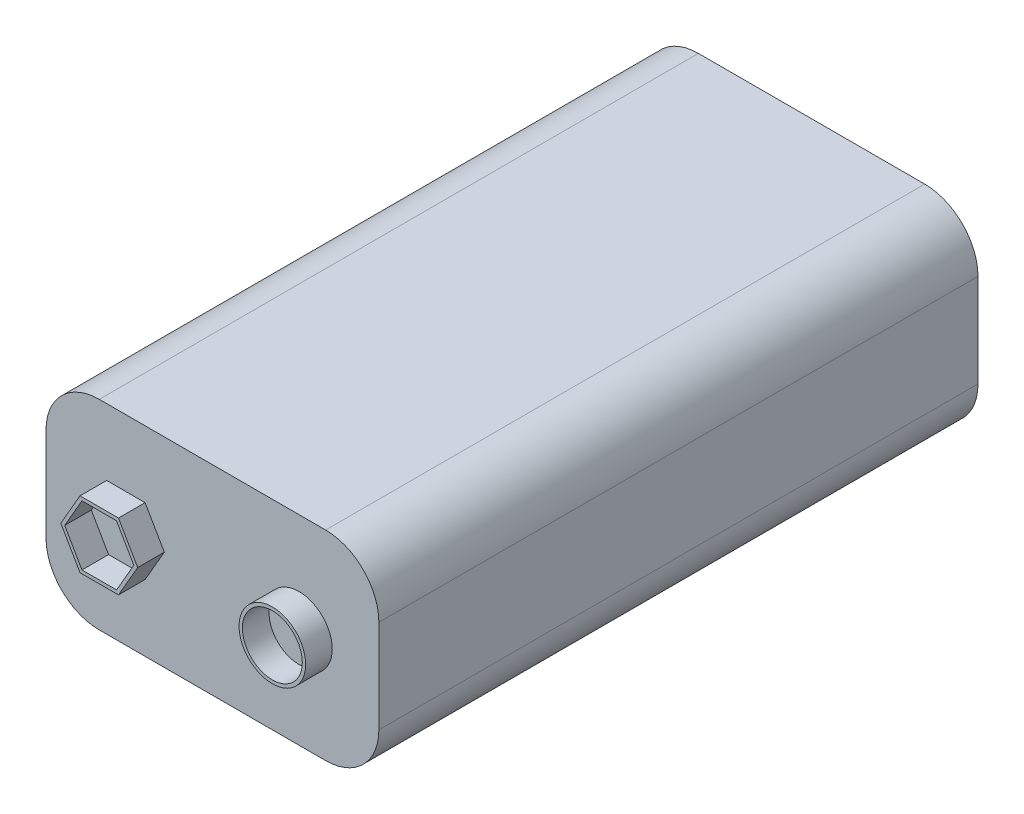
ISO-10303-21;
HEADER;
FILE_DESCRIPTION(('STEP AP214'),'2;1');
FILE_NAME('part.step','',(''),(''),'','','');
FILE_SCHEMA(('AUTOMOTIVE_DESIGN { 1 0 10303 214 1 1 1 1 }'));
ENDSEC;
DATA;
#1=APPLICATION_CONTEXT('core data for automotive mechanical design processes');
#2=APPLICATION_PROTOCOL_DEFINITION('international standard','automotive_design',2000,#1);
#3=PRODUCT_CONTEXT('',#1,'mechanical');
#4=PRODUCT('Part','Part','',(#3));
#5=PRODUCT_RELATED_PRODUCT_CATEGORY('part','',(#4));
#6=PRODUCT_DEFINITION_FORMATION('','',#4);
#7=PRODUCT_DEFINITION_CONTEXT('part definition',#1,'design');
#8=PRODUCT_DEFINITION('design','',#6,#7);
#9=PRODUCT_DEFINITION_SHAPE('','',#8);
#10=(LENGTH_UNIT() NAMED_UNIT(*) SI_UNIT(.MILLI.,.METRE.));
#11=(NAMED_UNIT(*) PLANE_ANGLE_UNIT() SI_UNIT($,.RADIAN.));
#12=(NAMED_UNIT(*) SI_UNIT($,.STERADIAN.) SOLID_ANGLE_UNIT());
#13=UNCERTAINTY_MEASURE_WITH_UNIT(LENGTH_MEASURE(1.E-05),#10,'distance_accuracy_value','');
#14=(GEOMETRIC_REPRESENTATION_CONTEXT(3) GLOBAL_UNCERTAINTY_ASSIGNED_CONTEXT((#13)) GLOBAL_UNIT_ASSIGNED_CONTEXT((#10,
#11,#12)) REPRESENTATION_CONTEXT('',''));
#15=CARTESIAN_POINT('',(0.,0.,0.));
#16=DIRECTION('',(0.,0.,1.));
#17=DIRECTION('',(1.,0.,0.));
#18=AXIS2_PLACEMENT_3D('',#15,#16,#17);
#19=CARTESIAN_POINT('',(21.,11.,45.));
#20=DIRECTION('',(0.,0.,-1.));
#21=DIRECTION('',(-1.,0.,0.));
#22=AXIS2_PLACEMENT_3D('',#19,#20,#21);
#23=PLANE('',#22);
#24=CARTESIAN_POINT('',(19.,7.5,45.));
#25=DIRECTION('',(0.,0.,1.));
#26=DIRECTION('',(1.,0.,0.));
#27=AXIS2_PLACEMENT_3D('',#24,#25,#26);
#28=CIRCLE('',#27,2.5);
#29=CARTESIAN_POINT('',(21.5,7.5,45.));
#30=VERTEX_POINT('',#29);
#31=EDGE_CURVE('E11',#30,#30,#28,.T.);
#32=ORIENTED_EDGE('',*,*,#31,.F.);
#33=EDGE_LOOP('',(#32));
#34=FACE_BOUND('',#33,.T.);
#35=CARTESIAN_POINT('',(21.,11.,45.));
#36=DIRECTION('',(0.,0.,1.));
#37=DIRECTION('',(-1.,0.,0.));
#38=AXIS2_PLACEMENT_3D('',#35,#36,#37);
#39=CIRCLE('',#38,4.);
#40=CARTESIAN_POINT('',(25.,11.,45.));
#41=VERTEX_POINT('',#40);
#42=CARTESIAN_POINT('',(21.,15.,45.));
#43=VERTEX_POINT('',#42);
#44=EDGE_CURVE('E283',#41,#43,#39,.T.);
#45=ORIENTED_EDGE('',*,*,#44,.T.);
#46=DIRECTION('',(-1.,0.,0.));
#47=VECTOR('',#46,1.);
#48=CARTESIAN_POINT('',(4.,15.,45.));
#49=LINE('',#48,#47);
#50=CARTESIAN_POINT('',(4.,15.,45.));
#51=VERTEX_POINT('',#50);
#52=EDGE_CURVE('E286',#43,#51,#49,.T.);
#53=ORIENTED_EDGE('',*,*,#52,.T.);
#54=CARTESIAN_POINT('',(4.,11.,45.));
#55=DIRECTION('',(0.,0.,1.));
#56=DIRECTION('',(-1.,0.,0.));
#57=AXIS2_PLACEMENT_3D('',#54,#55,#56);
#58=CIRCLE('',#57,4.);
#59=CARTESIAN_POINT('',(0.,11.,45.));
#60=VERTEX_POINT('',#59);
#61=EDGE_CURVE('E289',#51,#60,#58,.T.);
#62=ORIENTED_EDGE('',*,*,#61,.T.);
#63=DIRECTION('',(0.,-1.,0.));
#64=VECTOR('',#63,1.);
#65=CARTESIAN_POINT('',(0.,4.,45.));
#66=LINE('',#65,#64);
#67=CARTESIAN_POINT('',(0.,4.,45.));
#68=VERTEX_POINT('',#67);
#69=EDGE_CURVE('E291',#60,#68,#66,.T.);
#70=ORIENTED_EDGE('',*,*,#69,.T.);
#71=CARTESIAN_POINT('',(4.,4.,45.));
#72=DIRECTION('',(0.,0.,1.));
#73=DIRECTION('',(-1.,0.,0.));
#74=AXIS2_PLACEMENT_3D('',#71,#72,#73);
#75=CIRCLE('',#74,4.);
#76=CARTESIAN_POINT('',(4.,0.,45.));
#77=VERTEX_POINT('',#76);
#78=EDGE_CURVE('E293',#68,#77,#75,.T.);
#79=ORIENTED_EDGE('',*,*,#78,.T.);
#80=DIRECTION('',(1.,0.,0.));
#81=VECTOR('',#80,1.);
#82=CARTESIAN_POINT('',(4.,0.,45.));
#83=LINE('',#82,#81);
#84=CARTESIAN_POINT('',(21.,0.,45.));
#85=VERTEX_POINT('',#84);
#86=EDGE_CURVE('E295',#77,#85,#83,.T.);
#87=ORIENTED_EDGE('',*,*,#86,.T.);
#88=CARTESIAN_POINT('',(21.,4.,45.));
#89=DIRECTION('',(0.,0.,1.));
#90=DIRECTION('',(-1.,0.,0.));
#91=AXIS2_PLACEMENT_3D('',#88,#89,#90);
#92=CIRCLE('',#91,4.);
#93=CARTESIAN_POINT('',(25.,4.,45.));
#94=VERTEX_POINT('',#93);
#95=EDGE_CURVE('E297',#85,#94,#92,.T.);
#96=ORIENTED_EDGE('',*,*,#95,.T.);
#97=DIRECTION('',(0.,1.,0.));
#98=VECTOR('',#97,1.);
#99=CARTESIAN_POINT('',(25.,4.,45.));
#100=LINE('',#99,#98);
#101=EDGE_CURVE('E299',#94,#41,#100,.T.);
#102=ORIENTED_EDGE('',*,*,#101,.T.);
#103=EDGE_LOOP('',(#45,#53,#62,#70,#79,#87,#96,#102));
#104=FACE_BOUND('',#103,.T.);
#105=DIRECTION('',(0.5,0.866025403784439,0.));
#106=VECTOR('',#105,1.);
#107=CARTESIAN_POINT('',(7.44337567297406,5.,45.));
#108=LINE('',#107,#106);
#109=CARTESIAN_POINT('',(7.44337567297406,5.,45.));
#110=VERTEX_POINT('',#109);
#111=CARTESIAN_POINT('',(8.88675134594813,7.5,45.));
#112=VERTEX_POINT('',#111);
#113=EDGE_CURVE('E191',#110,#112,#108,.T.);
#114=ORIENTED_EDGE('',*,*,#113,.F.);
#115=DIRECTION('',(1.,0.,0.));
#116=VECTOR('',#115,1.);
#117=CARTESIAN_POINT('',(4.55662432702594,5.,45.));
#118=LINE('',#117,#116);
#119=CARTESIAN_POINT('',(4.55662432702594,5.,45.));
#120=VERTEX_POINT('',#119);
#121=EDGE_CURVE('E234',#120,#110,#118,.T.);
#122=ORIENTED_EDGE('',*,*,#121,.F.);
#123=DIRECTION('',(0.5,-0.866025403784439,0.));
#124=VECTOR('',#123,1.);
#125=CARTESIAN_POINT('',(3.11324865405187,7.5,45.));
#126=LINE('',#125,#124);
#127=CARTESIAN_POINT('',(3.11324865405187,7.5,45.));
#128=VERTEX_POINT('',#127);
#129=EDGE_CURVE('E252',#128,#120,#126,.T.);
#130=ORIENTED_EDGE('',*,*,#129,.F.);
#131=DIRECTION('',(-0.5,-0.866025403784439,0.));
#132=VECTOR('',#131,1.);
#133=CARTESIAN_POINT('',(4.55662432702593,10.,45.));
#134=LINE('',#133,#132);
#135=CARTESIAN_POINT('',(4.55662432702593,10.,45.));
#136=VERTEX_POINT('',#135);
#137=EDGE_CURVE('E249',#136,#128,#134,.T.);
#138=ORIENTED_EDGE('',*,*,#137,.F.);
#139=DIRECTION('',(-1.,0.,0.));
#140=VECTOR('',#139,1.);
#141=CARTESIAN_POINT('',(7.44337567297406,10.,45.));
#142=LINE('',#141,#140);
#143=CARTESIAN_POINT('',(7.44337567297407,10.,45.));
#144=VERTEX_POINT('',#143);
#145=EDGE_CURVE('E57',#144,#136,#142,.T.);
#146=ORIENTED_EDGE('',*,*,#145,.F.);
#147=DIRECTION('',(-0.5,0.866025403784439,0.));
#148=VECTOR('',#147,1.);
#149=CARTESIAN_POINT('',(8.88675134594813,7.5,45.));
#150=LINE('',#149,#148);
#151=EDGE_CURVE('E52',#112,#144,#150,.T.);
#152=ORIENTED_EDGE('',*,*,#151,.F.);
#153=EDGE_LOOP('',(#114,#122,#130,#138,#146,#152));
#154=FACE_BOUND('',#153,.T.);
#155=ADVANCED_FACE('F36',(#34,#104,#154),#23,.F.);
#156=CARTESIAN_POINT('',(21.,11.,45.));
#157=DIRECTION('',(0.,0.,-1.));
#158=DIRECTION('',(-1.,0.,0.));
#159=AXIS2_PLACEMENT_3D('',#156,#157,#158);
#160=CYLINDRICAL_SURFACE('',#159,4.);
#161=CARTESIAN_POINT('',(21.,11.,0.));
#162=DIRECTION('',(0.,0.,1.));
#163=DIRECTION('',(-1.,0.,0.));
#164=AXIS2_PLACEMENT_3D('',#161,#162,#163);
#165=CIRCLE('',#164,4.);
#166=CARTESIAN_POINT('',(25.,11.,0.));
#167=VERTEX_POINT('',#166);
#168=CARTESIAN_POINT('',(21.,15.,0.));
#169=VERTEX_POINT('',#168);
#170=EDGE_CURVE('E281',#167,#169,#165,.T.);
#171=ORIENTED_EDGE('',*,*,#170,.T.);
#172=DIRECTION('',(0.,0.,-1.));
#173=VECTOR('',#172,1.);
#174=CARTESIAN_POINT('',(21.,15.,45.));
#175=LINE('',#174,#173);
#176=EDGE_CURVE('E40',#43,#169,#175,.T.);
#177=ORIENTED_EDGE('',*,*,#176,.F.);
#178=ORIENTED_EDGE('',*,*,#44,.F.);
#179=DIRECTION('',(0.,0.,-1.));
#180=VECTOR('',#179,1.);
#181=CARTESIAN_POINT('',(25.,11.,45.));
#182=LINE('',#181,#180);
#183=EDGE_CURVE('E301',#41,#167,#182,.T.);
#184=ORIENTED_EDGE('',*,*,#183,.T.);
#185=EDGE_LOOP('',(#171,#177,#178,#184));
#186=FACE_BOUND('',#185,.T.);
#187=ADVANCED_FACE('F38',(#186),#160,.T.);
#188=CARTESIAN_POINT('',(4.,15.,45.));
#189=DIRECTION('',(0.,-1.,0.));
#190=DIRECTION('',(0.,0.,-1.));
#191=AXIS2_PLACEMENT_3D('',#188,#189,#190);
#192=PLANE('',#191);
#193=DIRECTION('',(-1.,0.,0.));
#194=VECTOR('',#193,1.);
#195=CARTESIAN_POINT('',(4.,15.,0.));
#196=LINE('',#195,#194);
#197=CARTESIAN_POINT('',(4.,15.,0.));
#198=VERTEX_POINT('',#197);
#199=EDGE_CURVE('E304',#169,#198,#196,.T.);
#200=ORIENTED_EDGE('',*,*,#199,.T.);
#201=DIRECTION('',(0.,0.,-1.));
#202=VECTOR('',#201,1.);
#203=CARTESIAN_POINT('',(4.,15.,45.));
#204=LINE('',#203,#202);
#205=EDGE_CURVE('E333',#51,#198,#204,.T.);
#206=ORIENTED_EDGE('',*,*,#205,.F.);
#207=ORIENTED_EDGE('',*,*,#52,.F.);
#208=ORIENTED_EDGE('',*,*,#176,.T.);
#209=EDGE_LOOP('',(#200,#206,#207,#208));
#210=FACE_BOUND('',#209,.T.);
#211=ADVANCED_FACE('F342',(#210),#192,.F.);
#212=CARTESIAN_POINT('',(4.,11.,45.));
#213=DIRECTION('',(0.,0.,-1.));
#214=DIRECTION('',(-1.,0.,0.));
#215=AXIS2_PLACEMENT_3D('',#212,#213,#214);
#216=CYLINDRICAL_SURFACE('',#215,4.);
#217=CARTESIAN_POINT('',(4.,11.,0.));
#218=DIRECTION('',(0.,0.,1.));
#219=DIRECTION('',(-1.,0.,0.));
#220=AXIS2_PLACEMENT_3D('',#217,#218,#219);
#221=CIRCLE('',#220,4.);
#222=CARTESIAN_POINT('',(0.,11.,0.));
#223=VERTEX_POINT('',#222);
#224=EDGE_CURVE('E306',#198,#223,#221,.T.);
#225=ORIENTED_EDGE('',*,*,#224,.T.);
#226=DIRECTION('',(0.,0.,-1.));
#227=VECTOR('',#226,1.);
#228=CARTESIAN_POINT('',(0.,11.,45.));
#229=LINE('',#228,#227);
#230=EDGE_CURVE('E331',#60,#223,#229,.T.);
#231=ORIENTED_EDGE('',*,*,#230,.F.);
#232=ORIENTED_EDGE('',*,*,#61,.F.);
#233=ORIENTED_EDGE('',*,*,#205,.T.);
#234=EDGE_LOOP('',(#225,#231,#232,#233));
#235=FACE_BOUND('',#234,.T.);
#236=ADVANCED_FACE('F354',(#235),#216,.T.);
#237=CARTESIAN_POINT('',(0.,4.,45.));
#238=DIRECTION('',(1.,0.,0.));
#239=DIRECTION('',(0.,0.,-1.));
#240=AXIS2_PLACEMENT_3D('',#237,#238,#239);
#241=PLANE('',#240);
#242=DIRECTION('',(0.,-1.,0.));
#243=VECTOR('',#242,1.);
#244=CARTESIAN_POINT('',(0.,4.,0.));
#245=LINE('',#244,#243);
#246=CARTESIAN_POINT('',(0.,4.,0.));
#247=VERTEX_POINT('',#246);
#248=EDGE_CURVE('E308',#223,#247,#245,.T.);
#249=ORIENTED_EDGE('',*,*,#248,.T.);
#250=DIRECTION('',(0.,0.,-1.));
#251=VECTOR('',#250,1.);
#252=CARTESIAN_POINT('',(0.,4.,45.));
#253=LINE('',#252,#251);
#254=EDGE_CURVE('E328',#68,#247,#253,.T.);
#255=ORIENTED_EDGE('',*,*,#254,.F.);
#256=ORIENTED_EDGE('',*,*,#69,.F.);
#257=ORIENTED_EDGE('',*,*,#230,.T.);
#258=EDGE_LOOP('',(#249,#255,#256,#257));
#259=FACE_BOUND('',#258,.T.);
#260=ADVANCED_FACE('F357',(#259),#241,.F.);
#261=CARTESIAN_POINT('',(4.,4.,45.));
#262=DIRECTION('',(0.,0.,-1.));
#263=DIRECTION('',(-1.,0.,0.));
#264=AXIS2_PLACEMENT_3D('',#261,#262,#263);
#265=CYLINDRICAL_SURFACE('',#264,4.);
#266=CARTESIAN_POINT('',(4.,4.,0.));
#267=DIRECTION('',(0.,0.,1.));
#268=DIRECTION('',(-1.,0.,0.));
#269=AXIS2_PLACEMENT_3D('',#266,#267,#268);
#270=CIRCLE('',#269,4.);
#271=CARTESIAN_POINT('',(4.,0.,0.));
#272=VERTEX_POINT('',#271);
#273=EDGE_CURVE('E310',#247,#272,#270,.T.);
#274=ORIENTED_EDGE('',*,*,#273,.T.);
#275=DIRECTION('',(0.,0.,-1.));
#276=VECTOR('',#275,1.);
#277=CARTESIAN_POINT('',(4.,0.,45.));
#278=LINE('',#277,#276);
#279=EDGE_CURVE('E325',#77,#272,#278,.T.);
#280=ORIENTED_EDGE('',*,*,#279,.F.);
#281=ORIENTED_EDGE('',*,*,#78,.F.);
#282=ORIENTED_EDGE('',*,*,#254,.T.);
#283=EDGE_LOOP('',(#274,#280,#281,#282));
#284=FACE_BOUND('',#283,.T.);
#285=ADVANCED_FACE('F375',(#284),#265,.T.);
#286=CARTESIAN_POINT('',(4.,0.,45.));
#287=DIRECTION('',(0.,1.,0.));
#288=DIRECTION('',(0.,0.,1.));
#289=AXIS2_PLACEMENT_3D('',#286,#287,#288);
#290=PLANE('',#289);
#291=DIRECTION('',(1.,0.,0.));
#292=VECTOR('',#291,1.);
#293=CARTESIAN_POINT('',(4.,0.,0.));
#294=LINE('',#293,#292);
#295=CARTESIAN_POINT('',(21.,0.,0.));
#296=VERTEX_POINT('',#295);
#297=EDGE_CURVE('E312',#272,#296,#294,.T.);
#298=ORIENTED_EDGE('',*,*,#297,.T.);
#299=DIRECTION('',(0.,0.,-1.));
#300=VECTOR('',#299,1.);
#301=CARTESIAN_POINT('',(21.,0.,45.));
#302=LINE('',#301,#300);
#303=EDGE_CURVE('E322',#85,#296,#302,.T.);
#304=ORIENTED_EDGE('',*,*,#303,.F.);
#305=ORIENTED_EDGE('',*,*,#86,.F.);
#306=ORIENTED_EDGE('',*,*,#279,.T.);
#307=EDGE_LOOP('',(#298,#304,#305,#306));
#308=FACE_BOUND('',#307,.T.);
#309=ADVANCED_FACE('F372',(#308),#290,.F.);
#310=CARTESIAN_POINT('',(21.,4.,45.));
#311=DIRECTION('',(0.,0.,-1.));
#312=DIRECTION('',(-1.,0.,0.));
#313=AXIS2_PLACEMENT_3D('',#310,#311,#312);
#314=CYLINDRICAL_SURFACE('',#313,4.);
#315=CARTESIAN_POINT('',(21.,4.,0.));
#316=DIRECTION('',(0.,0.,1.));
#317=DIRECTION('',(-1.,0.,0.));
#318=AXIS2_PLACEMENT_3D('',#315,#316,#317);
#319=CIRCLE('',#318,4.);
#320=CARTESIAN_POINT('',(25.,4.,0.));
#321=VERTEX_POINT('',#320);
#322=EDGE_CURVE('E314',#296,#321,#319,.T.);
#323=ORIENTED_EDGE('',*,*,#322,.T.);
#324=DIRECTION('',(0.,0.,-1.));
#325=VECTOR('',#324,1.);
#326=CARTESIAN_POINT('',(25.,4.,45.));
#327=LINE('',#326,#325);
#328=EDGE_CURVE('E319',#94,#321,#327,.T.);
#329=ORIENTED_EDGE('',*,*,#328,.F.);
#330=ORIENTED_EDGE('',*,*,#95,.F.);
#331=ORIENTED_EDGE('',*,*,#303,.T.);
#332=EDGE_LOOP('',(#323,#329,#330,#331));
#333=FACE_BOUND('',#332,.T.);
#334=ADVANCED_FACE('F368',(#333),#314,.T.);
#335=CARTESIAN_POINT('',(25.,4.,45.));
#336=DIRECTION('',(-1.,0.,0.));
#337=DIRECTION('',(0.,0.,1.));
#338=AXIS2_PLACEMENT_3D('',#335,#336,#337);
#339=PLANE('',#338);
#340=DIRECTION('',(0.,1.,0.));
#341=VECTOR('',#340,1.);
#342=CARTESIAN_POINT('',(25.,4.,0.));
#343=LINE('',#342,#341);
#344=EDGE_CURVE('E287',#321,#167,#343,.T.);
#345=ORIENTED_EDGE('',*,*,#344,.T.);
#346=ORIENTED_EDGE('',*,*,#183,.F.);
#347=ORIENTED_EDGE('',*,*,#101,.F.);
#348=ORIENTED_EDGE('',*,*,#328,.T.);
#349=EDGE_LOOP('',(#345,#346,#347,#348));
#350=FACE_BOUND('',#349,.T.);
#351=ADVANCED_FACE('F366',(#350),#339,.F.);
#352=CARTESIAN_POINT('',(21.,11.,0.));
#353=DIRECTION('',(0.,0.,-1.));
#354=DIRECTION('',(-1.,0.,0.));
#355=AXIS2_PLACEMENT_3D('',#352,#353,#354);
#356=PLANE('',#355);
#357=ORIENTED_EDGE('',*,*,#170,.F.);
#358=ORIENTED_EDGE('',*,*,#344,.F.);
#359=ORIENTED_EDGE('',*,*,#322,.F.);
#360=ORIENTED_EDGE('',*,*,#297,.F.);
#361=ORIENTED_EDGE('',*,*,#273,.F.);
#362=ORIENTED_EDGE('',*,*,#248,.F.);
#363=ORIENTED_EDGE('',*,*,#224,.F.);
#364=ORIENTED_EDGE('',*,*,#199,.F.);
#365=EDGE_LOOP('',(#357,#358,#359,#360,#361,#362,#363,#364));
#366=FACE_BOUND('',#365,.T.);
#367=ADVANCED_FACE('F349',(#366),#356,.T.);
#368=CARTESIAN_POINT('',(19.,7.5,47.));
#369=DIRECTION('',(0.,0.,1.));
#370=DIRECTION('',(1.,0.,0.));
#371=AXIS2_PLACEMENT_3D('',#368,#369,#370);
#372=PLANE('',#371);
#373=CARTESIAN_POINT('',(19.,7.5,47.));
#374=DIRECTION('',(0.,0.,1.));
#375=DIRECTION('',(1.,0.,0.));
#376=AXIS2_PLACEMENT_3D('',#373,#374,#375);
#377=CIRCLE('',#376,2.5);
#378=CARTESIAN_POINT('',(21.5,7.5,47.));
#379=VERTEX_POINT('',#378);
#380=EDGE_CURVE('E277',#379,#379,#377,.T.);
#381=ORIENTED_EDGE('',*,*,#380,.T.);
#382=EDGE_LOOP('',(#381));
#383=FACE_BOUND('',#382,.T.);
#384=CARTESIAN_POINT('',(19.,7.5,47.));
#385=DIRECTION('',(0.,0.,1.));
#386=DIRECTION('',(1.,0.,0.));
#387=AXIS2_PLACEMENT_3D('',#384,#385,#386);
#388=CIRCLE('',#387,2.25);
#389=CARTESIAN_POINT('',(21.25,7.5,47.));
#390=VERTEX_POINT('',#389);
#391=EDGE_CURVE('E274',#390,#390,#388,.T.);
#392=ORIENTED_EDGE('',*,*,#391,.F.);
#393=EDGE_LOOP('',(#392));
#394=FACE_BOUND('',#393,.T.);
#395=ADVANCED_FACE('F462',(#383,#394),#372,.T.);
#396=CARTESIAN_POINT('',(19.,7.5,47.));
#397=DIRECTION('',(0.,0.,-1.));
#398=DIRECTION('',(-1.,0.,0.));
#399=AXIS2_PLACEMENT_3D('',#396,#397,#398);
#400=CYLINDRICAL_SURFACE('',#399,2.5);
#401=ORIENTED_EDGE('',*,*,#380,.F.);
#402=EDGE_LOOP('',(#401));
#403=FACE_BOUND('',#402,.T.);
#404=ORIENTED_EDGE('',*,*,#31,.T.);
#405=EDGE_LOOP('',(#404));
#406=FACE_BOUND('',#405,.T.);
#407=ADVANCED_FACE('F460',(#403,#406),#400,.T.);
#408=CARTESIAN_POINT('',(19.,7.5,47.));
#409=DIRECTION('',(0.,0.,-1.));
#410=DIRECTION('',(-1.,0.,0.));
#411=AXIS2_PLACEMENT_3D('',#408,#409,#410);
#412=CYLINDRICAL_SURFACE('',#411,2.25);
#413=ORIENTED_EDGE('',*,*,#391,.T.);
#414=EDGE_LOOP('',(#413));
#415=FACE_BOUND('',#414,.T.);
#416=CARTESIAN_POINT('',(19.,7.5,45.));
#417=DIRECTION('',(0.,0.,1.));
#418=DIRECTION('',(1.,0.,0.));
#419=AXIS2_PLACEMENT_3D('',#416,#417,#418);
#420=CIRCLE('',#419,2.25);
#421=CARTESIAN_POINT('',(21.25,7.5,45.));
#422=VERTEX_POINT('',#421);
#423=EDGE_CURVE('E273',#422,#422,#420,.T.);
#424=ORIENTED_EDGE('',*,*,#423,.F.);
#425=EDGE_LOOP('',(#424));
#426=FACE_BOUND('',#425,.T.);
#427=ADVANCED_FACE('F396',(#415,#426),#412,.F.);
#428=ORIENTED_EDGE('',*,*,#423,.T.);
#429=EDGE_LOOP('',(#428));
#430=FACE_BOUND('',#429,.T.);
#431=ADVANCED_FACE('F387',(#430),#23,.F.);
#432=CARTESIAN_POINT('',(0.,0.,47.));
#433=DIRECTION('',(0.,0.,1.));
#434=DIRECTION('',(1.,0.,0.));
#435=AXIS2_PLACEMENT_3D('',#432,#433,#434);
#436=PLANE('',#435);
#437=DIRECTION('',(0.5,0.866025403784439,0.));
#438=VECTOR('',#437,1.);
#439=CARTESIAN_POINT('',(7.44337567297406,5.,47.));
#440=LINE('',#439,#438);
#441=CARTESIAN_POINT('',(7.44337567297406,5.,47.));
#442=VERTEX_POINT('',#441);
#443=CARTESIAN_POINT('',(8.88675134594813,7.5,47.));
#444=VERTEX_POINT('',#443);
#445=EDGE_CURVE('E230',#442,#444,#440,.T.);
#446=ORIENTED_EDGE('',*,*,#445,.T.);
#447=DIRECTION('',(-0.5,0.866025403784439,0.));
#448=VECTOR('',#447,1.);
#449=CARTESIAN_POINT('',(8.88675134594813,7.5,47.));
#450=LINE('',#449,#448);
#451=CARTESIAN_POINT('',(7.44337567297406,10.,47.));
#452=VERTEX_POINT('',#451);
#453=EDGE_CURVE('E233',#444,#452,#450,.T.);
#454=ORIENTED_EDGE('',*,*,#453,.T.);
#455=DIRECTION('',(-1.,0.,0.));
#456=VECTOR('',#455,1.);
#457=CARTESIAN_POINT('',(7.44337567297406,10.,47.));
#458=LINE('',#457,#456);
#459=CARTESIAN_POINT('',(4.55662432702593,10.,47.));
#460=VERTEX_POINT('',#459);
#461=EDGE_CURVE('E236',#452,#460,#458,.T.);
#462=ORIENTED_EDGE('',*,*,#461,.T.);
#463=DIRECTION('',(-0.5,-0.866025403784439,0.));
#464=VECTOR('',#463,1.);
#465=CARTESIAN_POINT('',(4.55662432702593,10.,47.));
#466=LINE('',#465,#464);
#467=CARTESIAN_POINT('',(3.11324865405187,7.5,47.));
#468=VERTEX_POINT('',#467);
#469=EDGE_CURVE('E238',#460,#468,#466,.T.);
#470=ORIENTED_EDGE('',*,*,#469,.T.);
#471=DIRECTION('',(0.5,-0.866025403784439,0.));
#472=VECTOR('',#471,1.);
#473=CARTESIAN_POINT('',(3.11324865405187,7.5,47.));
#474=LINE('',#473,#472);
#475=CARTESIAN_POINT('',(4.55662432702594,5.,47.));
#476=VERTEX_POINT('',#475);
#477=EDGE_CURVE('E240',#468,#476,#474,.T.);
#478=ORIENTED_EDGE('',*,*,#477,.T.);
#479=DIRECTION('',(1.,0.,0.));
#480=VECTOR('',#479,1.);
#481=CARTESIAN_POINT('',(4.55662432702594,5.,47.));
#482=LINE('',#481,#480);
#483=EDGE_CURVE('E242',#476,#442,#482,.T.);
#484=ORIENTED_EDGE('',*,*,#483,.T.);
#485=EDGE_LOOP('',(#446,#454,#462,#470,#478,#484));
#486=FACE_BOUND('',#485,.T.);
#487=DIRECTION('',(-0.5,0.866025403784439,0.));
#488=VECTOR('',#487,1.);
#489=CARTESIAN_POINT('',(8.59807621135332,7.5,47.));
#490=LINE('',#489,#488);
#491=CARTESIAN_POINT('',(8.59807621135332,7.5,47.));
#492=VERTEX_POINT('',#491);
#493=CARTESIAN_POINT('',(7.29903810567666,9.74999999999999,47.));
#494=VERTEX_POINT('',#493);
#495=EDGE_CURVE('E183',#492,#494,#490,.T.);
#496=ORIENTED_EDGE('',*,*,#495,.F.);
#497=DIRECTION('',(0.5,0.866025403784439,0.));
#498=VECTOR('',#497,1.);
#499=CARTESIAN_POINT('',(7.29903810567666,5.25,47.));
#500=LINE('',#499,#498);
#501=CARTESIAN_POINT('',(7.29903810567666,5.25,47.));
#502=VERTEX_POINT('',#501);
#503=EDGE_CURVE('E173',#502,#492,#500,.T.);
#504=ORIENTED_EDGE('',*,*,#503,.F.);
#505=DIRECTION('',(1.,0.,0.));
#506=VECTOR('',#505,1.);
#507=CARTESIAN_POINT('',(4.70096189432334,5.25,47.));
#508=LINE('',#507,#506);
#509=CARTESIAN_POINT('',(4.70096189432334,5.25,47.));
#510=VERTEX_POINT('',#509);
#511=EDGE_CURVE('E206',#510,#502,#508,.T.);
#512=ORIENTED_EDGE('',*,*,#511,.F.);
#513=DIRECTION('',(0.5,-0.866025403784438,0.));
#514=VECTOR('',#513,1.);
#515=CARTESIAN_POINT('',(3.40192378864669,7.5,47.));
#516=LINE('',#515,#514);
#517=CARTESIAN_POINT('',(3.40192378864669,7.5,47.));
#518=VERTEX_POINT('',#517);
#519=EDGE_CURVE('E203',#518,#510,#516,.T.);
#520=ORIENTED_EDGE('',*,*,#519,.F.);
#521=DIRECTION('',(-0.5,-0.866025403784439,0.));
#522=VECTOR('',#521,1.);
#523=CARTESIAN_POINT('',(4.70096189432334,9.74999999999999,47.));
#524=LINE('',#523,#522);
#525=CARTESIAN_POINT('',(4.70096189432334,9.74999999999999,47.));
#526=VERTEX_POINT('',#525);
#527=EDGE_CURVE('E199',#526,#518,#524,.T.);
#528=ORIENTED_EDGE('',*,*,#527,.F.);
#529=DIRECTION('',(-1.,0.,0.));
#530=VECTOR('',#529,1.);
#531=CARTESIAN_POINT('',(7.29903810567666,9.74999999999999,47.));
#532=LINE('',#531,#530);
#533=EDGE_CURVE('E197',#494,#526,#532,.T.);
#534=ORIENTED_EDGE('',*,*,#533,.F.);
#535=EDGE_LOOP('',(#496,#504,#512,#520,#528,#534));
#536=FACE_BOUND('',#535,.T.);
#537=ADVANCED_FACE('F195',(#486,#536),#436,.T.);
#538=CARTESIAN_POINT('',(7.44337567297406,5.,47.));
#539=DIRECTION('',(-0.866025403784439,0.5,0.));
#540=DIRECTION('',(-0.5,-0.866025403784439,0.));
#541=AXIS2_PLACEMENT_3D('',#538,#539,#540);
#542=PLANE('',#541);
#543=ORIENTED_EDGE('',*,*,#113,.T.);
#544=DIRECTION('',(0.,0.,-1.));
#545=VECTOR('',#544,1.);
#546=CARTESIAN_POINT('',(8.88675134594813,7.5,47.));
#547=LINE('',#546,#545);
#548=EDGE_CURVE('E271',#444,#112,#547,.T.);
#549=ORIENTED_EDGE('',*,*,#548,.F.);
#550=ORIENTED_EDGE('',*,*,#445,.F.);
#551=DIRECTION('',(0.,0.,-1.));
#552=VECTOR('',#551,1.);
#553=CARTESIAN_POINT('',(7.44337567297406,5.,47.));
#554=LINE('',#553,#552);
#555=EDGE_CURVE('E244',#442,#110,#554,.T.);
#556=ORIENTED_EDGE('',*,*,#555,.T.);
#557=EDGE_LOOP('',(#543,#549,#550,#556));
#558=FACE_BOUND('',#557,.T.);
#559=ADVANCED_FACE('F434',(#558),#542,.F.);
#560=CARTESIAN_POINT('',(8.88675134594813,7.5,47.));
#561=DIRECTION('',(-0.866025403784439,-0.5,0.));
#562=DIRECTION('',(0.5,-0.866025403784439,0.));
#563=AXIS2_PLACEMENT_3D('',#560,#561,#562);
#564=PLANE('',#563);
#565=ORIENTED_EDGE('',*,*,#151,.T.);
#566=DIRECTION('',(0.,0.,-1.));
#567=VECTOR('',#566,1.);
#568=CARTESIAN_POINT('',(7.44337567297406,10.,47.));
#569=LINE('',#568,#567);
#570=EDGE_CURVE('E268',#452,#144,#569,.T.);
#571=ORIENTED_EDGE('',*,*,#570,.F.);
#572=ORIENTED_EDGE('',*,*,#453,.F.);
#573=ORIENTED_EDGE('',*,*,#548,.T.);
#574=EDGE_LOOP('',(#565,#571,#572,#573));
#575=FACE_BOUND('',#574,.T.);
#576=ADVANCED_FACE('F450',(#575),#564,.F.);
#577=CARTESIAN_POINT('',(7.44337567297406,10.,47.));
#578=DIRECTION('',(0.,-1.,0.));
#579=DIRECTION('',(0.,0.,-1.));
#580=AXIS2_PLACEMENT_3D('',#577,#578,#579);
#581=PLANE('',#580);
#582=ORIENTED_EDGE('',*,*,#145,.T.);
#583=DIRECTION('',(0.,0.,-1.));
#584=VECTOR('',#583,1.);
#585=CARTESIAN_POINT('',(4.55662432702593,10.,47.));
#586=LINE('',#585,#584);
#587=EDGE_CURVE('E265',#460,#136,#586,.T.);
#588=ORIENTED_EDGE('',*,*,#587,.F.);
#589=ORIENTED_EDGE('',*,*,#461,.F.);
#590=ORIENTED_EDGE('',*,*,#570,.T.);
#591=EDGE_LOOP('',(#582,#588,#589,#590));
#592=FACE_BOUND('',#591,.T.);
#593=ADVANCED_FACE('F446',(#592),#581,.F.);
#594=CARTESIAN_POINT('',(4.55662432702593,10.,47.));
#595=DIRECTION('',(0.866025403784439,-0.5,0.));
#596=DIRECTION('',(0.5,0.866025403784439,0.));
#597=AXIS2_PLACEMENT_3D('',#594,#595,#596);
#598=PLANE('',#597);
#599=ORIENTED_EDGE('',*,*,#137,.T.);
#600=DIRECTION('',(0.,0.,-1.));
#601=VECTOR('',#600,1.);
#602=CARTESIAN_POINT('',(3.11324865405187,7.5,47.));
#603=LINE('',#602,#601);
#604=EDGE_CURVE('E262',#468,#128,#603,.T.);
#605=ORIENTED_EDGE('',*,*,#604,.F.);
#606=ORIENTED_EDGE('',*,*,#469,.F.);
#607=ORIENTED_EDGE('',*,*,#587,.T.);
#608=EDGE_LOOP('',(#599,#605,#606,#607));
#609=FACE_BOUND('',#608,.T.);
#610=ADVANCED_FACE('F442',(#609),#598,.F.);
#611=CARTESIAN_POINT('',(3.11324865405187,7.5,47.));
#612=DIRECTION('',(0.866025403784439,0.5,0.));
#613=DIRECTION('',(-0.5,0.866025403784439,0.));
#614=AXIS2_PLACEMENT_3D('',#611,#612,#613);
#615=PLANE('',#614);
#616=ORIENTED_EDGE('',*,*,#129,.T.);
#617=DIRECTION('',(0.,0.,-1.));
#618=VECTOR('',#617,1.);
#619=CARTESIAN_POINT('',(4.55662432702594,5.,47.));
#620=LINE('',#619,#618);
#621=EDGE_CURVE('E259',#476,#120,#620,.T.);
#622=ORIENTED_EDGE('',*,*,#621,.F.);
#623=ORIENTED_EDGE('',*,*,#477,.F.);
#624=ORIENTED_EDGE('',*,*,#604,.T.);
#625=EDGE_LOOP('',(#616,#622,#623,#624));
#626=FACE_BOUND('',#625,.T.);
#627=ADVANCED_FACE('F438',(#626),#615,.F.);
#628=CARTESIAN_POINT('',(4.55662432702594,5.,47.));
#629=DIRECTION('',(0.,1.,0.));
#630=DIRECTION('',(0.,0.,1.));
#631=AXIS2_PLACEMENT_3D('',#628,#629,#630);
#632=PLANE('',#631);
#633=ORIENTED_EDGE('',*,*,#121,.T.);
#634=ORIENTED_EDGE('',*,*,#555,.F.);
#635=ORIENTED_EDGE('',*,*,#483,.F.);
#636=ORIENTED_EDGE('',*,*,#621,.T.);
#637=EDGE_LOOP('',(#633,#634,#635,#636));
#638=FACE_BOUND('',#637,.T.);
#639=ADVANCED_FACE('F431',(#638),#632,.F.);
#640=CARTESIAN_POINT('',(7.29903810567666,5.25,47.));
#641=DIRECTION('',(-0.866025403784439,0.499999999999999,0.));
#642=DIRECTION('',(-0.499999999999999,-0.866025403784439,0.));
#643=AXIS2_PLACEMENT_3D('',#640,#641,#642);
#644=PLANE('',#643);
#645=DIRECTION('',(0.5,0.866025403784439,0.));
#646=VECTOR('',#645,1.);
#647=CARTESIAN_POINT('',(7.29903810567666,5.25,45.));
#648=LINE('',#647,#646);
#649=CARTESIAN_POINT('',(7.29903810567666,5.25,45.));
#650=VERTEX_POINT('',#649);
#651=CARTESIAN_POINT('',(8.59807621135332,7.5,45.));
#652=VERTEX_POINT('',#651);
#653=EDGE_CURVE('E208',#650,#652,#648,.T.);
#654=ORIENTED_EDGE('',*,*,#653,.F.);
#655=DIRECTION('',(0.,0.,-1.));
#656=VECTOR('',#655,1.);
#657=CARTESIAN_POINT('',(7.29903810567666,5.25,47.));
#658=LINE('',#657,#656);
#659=EDGE_CURVE('E179',#502,#650,#658,.T.);
#660=ORIENTED_EDGE('',*,*,#659,.F.);
#661=ORIENTED_EDGE('',*,*,#503,.T.);
#662=DIRECTION('',(0.,0.,-1.));
#663=VECTOR('',#662,1.);
#664=CARTESIAN_POINT('',(8.59807621135332,7.5,47.));
#665=LINE('',#664,#663);
#666=EDGE_CURVE('E177',#492,#652,#665,.T.);
#667=ORIENTED_EDGE('',*,*,#666,.T.);
#668=EDGE_LOOP('',(#654,#660,#661,#667));
#669=FACE_BOUND('',#668,.T.);
#670=ADVANCED_FACE('F176',(#669),#644,.T.);
#671=CARTESIAN_POINT('',(8.59807621135332,7.5,47.));
#672=DIRECTION('',(-0.866025403784438,-0.5,0.));
#673=DIRECTION('',(0.5,-0.866025403784439,0.));
#674=AXIS2_PLACEMENT_3D('',#671,#672,#673);
#675=PLANE('',#674);
#676=DIRECTION('',(-0.5,0.866025403784439,0.));
#677=VECTOR('',#676,1.);
#678=CARTESIAN_POINT('',(8.59807621135332,7.5,45.));
#679=LINE('',#678,#677);
#680=CARTESIAN_POINT('',(7.29903810567666,9.74999999999999,45.));
#681=VERTEX_POINT('',#680);
#682=EDGE_CURVE('E190',#652,#681,#679,.T.);
#683=ORIENTED_EDGE('',*,*,#682,.F.);
#684=ORIENTED_EDGE('',*,*,#666,.F.);
#685=ORIENTED_EDGE('',*,*,#495,.T.);
#686=DIRECTION('',(0.,0.,-1.));
#687=VECTOR('',#686,1.);
#688=CARTESIAN_POINT('',(7.29903810567666,9.74999999999999,47.));
#689=LINE('',#688,#687);
#690=EDGE_CURVE('E192',#494,#681,#689,.T.);
#691=ORIENTED_EDGE('',*,*,#690,.T.);
#692=EDGE_LOOP('',(#683,#684,#685,#691));
#693=FACE_BOUND('',#692,.T.);
#694=ADVANCED_FACE('F187',(#693),#675,.T.);
#695=CARTESIAN_POINT('',(7.29903810567666,9.74999999999999,47.));
#696=DIRECTION('',(0.,-1.,0.));
#697=DIRECTION('',(0.,0.,-1.));
#698=AXIS2_PLACEMENT_3D('',#695,#696,#697);
#699=PLANE('',#698);
#700=DIRECTION('',(-1.,0.,0.));
#701=VECTOR('',#700,1.);
#702=CARTESIAN_POINT('',(7.29903810567666,9.74999999999999,45.));
#703=LINE('',#702,#701);
#704=CARTESIAN_POINT('',(4.70096189432334,9.74999999999999,45.));
#705=VERTEX_POINT('',#704);
#706=EDGE_CURVE('E211',#681,#705,#703,.T.);
#707=ORIENTED_EDGE('',*,*,#706,.F.);
#708=ORIENTED_EDGE('',*,*,#690,.F.);
#709=ORIENTED_EDGE('',*,*,#533,.T.);
#710=DIRECTION('',(0.,0.,-1.));
#711=VECTOR('',#710,1.);
#712=CARTESIAN_POINT('',(4.70096189432334,9.74999999999999,47.));
#713=LINE('',#712,#711);
#714=EDGE_CURVE('E227',#526,#705,#713,.T.);
#715=ORIENTED_EDGE('',*,*,#714,.T.);
#716=EDGE_LOOP('',(#707,#708,#709,#715));
#717=FACE_BOUND('',#716,.T.);
#718=ADVANCED_FACE('F418',(#717),#699,.T.);
#719=CARTESIAN_POINT('',(4.70096189432334,9.74999999999999,47.));
#720=DIRECTION('',(0.866025403784439,-0.5,0.));
#721=DIRECTION('',(0.5,0.866025403784439,0.));
#722=AXIS2_PLACEMENT_3D('',#719,#720,#721);
#723=PLANE('',#722);
#724=DIRECTION('',(-0.5,-0.866025403784439,0.));
#725=VECTOR('',#724,1.);
#726=CARTESIAN_POINT('',(4.70096189432334,9.74999999999999,45.));
#727=LINE('',#726,#725);
#728=CARTESIAN_POINT('',(3.40192378864669,7.5,45.));
#729=VERTEX_POINT('',#728);
#730=EDGE_CURVE('E214',#705,#729,#727,.T.);
#731=ORIENTED_EDGE('',*,*,#730,.F.);
#732=ORIENTED_EDGE('',*,*,#714,.F.);
#733=ORIENTED_EDGE('',*,*,#527,.T.);
#734=DIRECTION('',(0.,0.,-1.));
#735=VECTOR('',#734,1.);
#736=CARTESIAN_POINT('',(3.40192378864669,7.5,47.));
#737=LINE('',#736,#735);
#738=EDGE_CURVE('E225',#518,#729,#737,.T.);
#739=ORIENTED_EDGE('',*,*,#738,.T.);
#740=EDGE_LOOP('',(#731,#732,#733,#739));
#741=FACE_BOUND('',#740,.T.);
#742=ADVANCED_FACE('F414',(#741),#723,.T.);
#743=CARTESIAN_POINT('',(3.40192378864669,7.5,47.));
#744=DIRECTION('',(0.866025403784439,0.5,0.));
#745=DIRECTION('',(-0.5,0.866025403784438,0.));
#746=AXIS2_PLACEMENT_3D('',#743,#744,#745);
#747=PLANE('',#746);
#748=DIRECTION('',(0.5,-0.866025403784438,0.));
#749=VECTOR('',#748,1.);
#750=CARTESIAN_POINT('',(3.40192378864669,7.5,45.));
#751=LINE('',#750,#749);
#752=CARTESIAN_POINT('',(4.70096189432334,5.25,45.));
#753=VERTEX_POINT('',#752);
#754=EDGE_CURVE('E217',#729,#753,#751,.T.);
#755=ORIENTED_EDGE('',*,*,#754,.F.);
#756=ORIENTED_EDGE('',*,*,#738,.F.);
#757=ORIENTED_EDGE('',*,*,#519,.T.);
#758=DIRECTION('',(0.,0.,-1.));
#759=VECTOR('',#758,1.);
#760=CARTESIAN_POINT('',(4.70096189432334,5.25,47.));
#761=LINE('',#760,#759);
#762=EDGE_CURVE('E223',#510,#753,#761,.T.);
#763=ORIENTED_EDGE('',*,*,#762,.T.);
#764=EDGE_LOOP('',(#755,#756,#757,#763));
#765=FACE_BOUND('',#764,.T.);
#766=ADVANCED_FACE('F404',(#765),#747,.T.);
#767=CARTESIAN_POINT('',(4.70096189432334,5.25,47.));
#768=DIRECTION('',(0.,1.,0.));
#769=DIRECTION('',(0.,0.,1.));
#770=AXIS2_PLACEMENT_3D('',#767,#768,#769);
#771=PLANE('',#770);
#772=DIRECTION('',(1.,0.,0.));
#773=VECTOR('',#772,1.);
#774=CARTESIAN_POINT('',(4.70096189432334,5.25,45.));
#775=LINE('',#774,#773);
#776=EDGE_CURVE('E184',#753,#650,#775,.T.);
#777=ORIENTED_EDGE('',*,*,#776,.F.);
#778=ORIENTED_EDGE('',*,*,#762,.F.);
#779=ORIENTED_EDGE('',*,*,#511,.T.);
#780=ORIENTED_EDGE('',*,*,#659,.T.);
#781=EDGE_LOOP('',(#777,#778,#779,#780));
#782=FACE_BOUND('',#781,.T.);
#783=ADVANCED_FACE('F399',(#782),#771,.T.);
#784=ORIENTED_EDGE('',*,*,#776,.T.);
#785=ORIENTED_EDGE('',*,*,#653,.T.);
#786=ORIENTED_EDGE('',*,*,#682,.T.);
#787=ORIENTED_EDGE('',*,*,#706,.T.);
#788=ORIENTED_EDGE('',*,*,#730,.T.);
#789=ORIENTED_EDGE('',*,*,#754,.T.);
#790=EDGE_LOOP('',(#784,#785,#786,#787,#788,#789));
#791=FACE_BOUND('',#790,.T.);
#792=ADVANCED_FACE('F388',(#791),#23,.F.);
#793=CLOSED_SHELL('',(#155,#187,#211,#236,#260,#285,#309,#334,#351,#367,#395,#407,#427,#431,
#537,#559,#576,#593,#610,#627,#639,#670,#694,#718,#742,#766,#783,#792));
#794=MANIFOLD_SOLID_BREP('B2',#793);
#795=ADVANCED_BREP_SHAPE_REPRESENTATION('',(#18,#794),#14);
#796=SHAPE_DEFINITION_REPRESENTATION(#9,#795);
ENDSEC;
END-ISO-10303-21;
